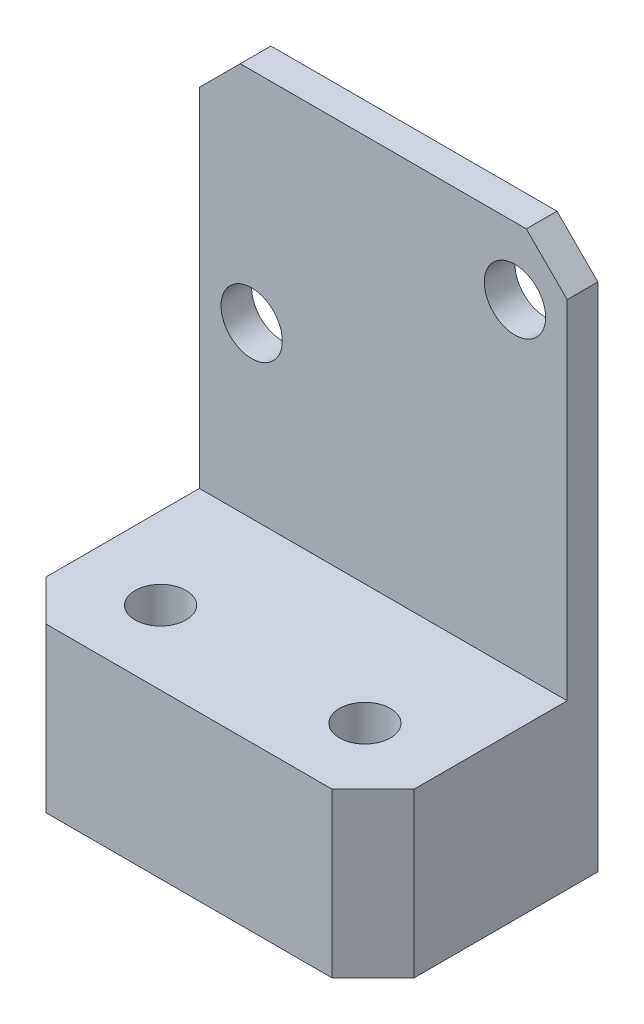
ISO-10303-21;
HEADER;
FILE_DESCRIPTION(('STEP AP214'),'2;1');
FILE_NAME('part.step','',(''),(''),'','','');
FILE_SCHEMA(('AUTOMOTIVE_DESIGN { 1 0 10303 214 1 1 1 1 }'));
ENDSEC;
DATA;
#1=APPLICATION_CONTEXT('core data for automotive mechanical design processes');
#2=APPLICATION_PROTOCOL_DEFINITION('international standard','automotive_design',2000,#1);
#3=PRODUCT_CONTEXT('',#1,'mechanical');
#4=PRODUCT('Part','Part','',(#3));
#5=PRODUCT_RELATED_PRODUCT_CATEGORY('part','',(#4));
#6=PRODUCT_DEFINITION_FORMATION('','',#4);
#7=PRODUCT_DEFINITION_CONTEXT('part definition',#1,'design');
#8=PRODUCT_DEFINITION('design','',#6,#7);
#9=PRODUCT_DEFINITION_SHAPE('','',#8);
#10=(LENGTH_UNIT() NAMED_UNIT(*) SI_UNIT(.MILLI.,.METRE.));
#11=(NAMED_UNIT(*) PLANE_ANGLE_UNIT() SI_UNIT($,.RADIAN.));
#12=(NAMED_UNIT(*) SI_UNIT($,.STERADIAN.) SOLID_ANGLE_UNIT());
#13=UNCERTAINTY_MEASURE_WITH_UNIT(LENGTH_MEASURE(1.E-05),#10,'distance_accuracy_value','');
#14=(GEOMETRIC_REPRESENTATION_CONTEXT(3) GLOBAL_UNCERTAINTY_ASSIGNED_CONTEXT((#13)) GLOBAL_UNIT_ASSIGNED_CONTEXT((#10,
#11,#12)) REPRESENTATION_CONTEXT('',''));
#15=CARTESIAN_POINT('',(0.,0.,0.));
#16=DIRECTION('',(0.,0.,1.));
#17=DIRECTION('',(1.,0.,0.));
#18=AXIS2_PLACEMENT_3D('',#15,#16,#17);
#19=CARTESIAN_POINT('',(-9.,7.,11.));
#20=DIRECTION('',(0.,-1.,0.));
#21=DIRECTION('',(0.,0.,-1.));
#22=AXIS2_PLACEMENT_3D('',#19,#20,#21);
#23=PLANE('',#22);
#24=DIRECTION('',(-1.,0.,0.));
#25=VECTOR('',#24,1.);
#26=CARTESIAN_POINT('',(-9.,7.,0.));
#27=LINE('',#26,#25);
#28=CARTESIAN_POINT('',(7.,7.,0.));
#29=VERTEX_POINT('',#28);
#30=CARTESIAN_POINT('',(-6.99999999999999,7.,0.));
#31=VERTEX_POINT('',#30);
#32=EDGE_CURVE('E150',#29,#31,#27,.T.);
#33=ORIENTED_EDGE('',*,*,#32,.T.);
#34=DIRECTION('',(0.,0.,1.));
#35=VECTOR('',#34,1.);
#36=CARTESIAN_POINT('',(-6.99999999999999,7.,11.));
#37=LINE('',#36,#35);
#38=CARTESIAN_POINT('',(-6.99999999999999,7.,1.5));
#39=VERTEX_POINT('',#38);
#40=EDGE_CURVE('E174',#31,#39,#37,.T.);
#41=ORIENTED_EDGE('',*,*,#40,.T.);
#42=DIRECTION('',(-1.,0.,0.));
#43=VECTOR('',#42,1.);
#44=CARTESIAN_POINT('',(-9.,7.,1.5));
#45=LINE('',#44,#43);
#46=CARTESIAN_POINT('',(7.00000000000001,7.,1.5));
#47=VERTEX_POINT('',#46);
#48=EDGE_CURVE('E140',#47,#39,#45,.T.);
#49=ORIENTED_EDGE('',*,*,#48,.F.);
#50=DIRECTION('',(0.,0.,-1.));
#51=VECTOR('',#50,1.);
#52=CARTESIAN_POINT('',(7.,7.,11.));
#53=LINE('',#52,#51);
#54=EDGE_CURVE('E171',#47,#29,#53,.T.);
#55=ORIENTED_EDGE('',*,*,#54,.T.);
#56=EDGE_LOOP('',(#33,#41,#49,#55));
#57=FACE_BOUND('',#56,.T.);
#58=ADVANCED_FACE('F34',(#57),#23,.F.);
#59=CARTESIAN_POINT('',(-9.,7.,11.));
#60=DIRECTION('',(1.,0.,0.));
#61=DIRECTION('',(0.,1.,0.));
#62=AXIS2_PLACEMENT_3D('',#59,#60,#61);
#63=PLANE('',#62);
#64=DIRECTION('',(0.,-1.,0.));
#65=VECTOR('',#64,1.);
#66=CARTESIAN_POINT('',(-9.,7.,1.5));
#67=LINE('',#66,#65);
#68=CARTESIAN_POINT('',(-9.,5.,1.5));
#69=VERTEX_POINT('',#68);
#70=CARTESIAN_POINT('',(-9.,-12.,1.5));
#71=VERTEX_POINT('',#70);
#72=EDGE_CURVE('E113',#69,#71,#67,.T.);
#73=ORIENTED_EDGE('',*,*,#72,.F.);
#74=DIRECTION('',(0.,0.,-1.));
#75=VECTOR('',#74,1.);
#76=CARTESIAN_POINT('',(-9.,5.,11.));
#77=LINE('',#76,#75);
#78=CARTESIAN_POINT('',(-9.,5.,0.));
#79=VERTEX_POINT('',#78);
#80=EDGE_CURVE('E165',#69,#79,#77,.T.);
#81=ORIENTED_EDGE('',*,*,#80,.T.);
#82=DIRECTION('',(0.,-1.,0.));
#83=VECTOR('',#82,1.);
#84=CARTESIAN_POINT('',(-9.,7.,0.));
#85=LINE('',#84,#83);
#86=CARTESIAN_POINT('',(-9.,-20.,0.));
#87=VERTEX_POINT('',#86);
#88=EDGE_CURVE('E142',#79,#87,#85,.T.);
#89=ORIENTED_EDGE('',*,*,#88,.T.);
#90=DIRECTION('',(0.,0.,-1.));
#91=VECTOR('',#90,1.);
#92=CARTESIAN_POINT('',(-9.,-20.,11.));
#93=LINE('',#92,#91);
#94=CARTESIAN_POINT('',(-9.,-20.,8.99999999999999));
#95=VERTEX_POINT('',#94);
#96=EDGE_CURVE('E162',#95,#87,#93,.T.);
#97=ORIENTED_EDGE('',*,*,#96,.F.);
#98=DIRECTION('',(0.,1.,0.));
#99=VECTOR('',#98,1.);
#100=CARTESIAN_POINT('',(-9.,-12.,8.99999999999999));
#101=LINE('',#100,#99);
#102=CARTESIAN_POINT('',(-9.,-12.,8.99999999999999));
#103=VERTEX_POINT('',#102);
#104=EDGE_CURVE('E139',#95,#103,#101,.T.);
#105=ORIENTED_EDGE('',*,*,#104,.T.);
#106=DIRECTION('',(0.,0.,1.));
#107=VECTOR('',#106,1.);
#108=CARTESIAN_POINT('',(-9.,-12.,1.5));
#109=LINE('',#108,#107);
#110=EDGE_CURVE('E131',#71,#103,#109,.T.);
#111=ORIENTED_EDGE('',*,*,#110,.F.);
#112=EDGE_LOOP('',(#73,#81,#89,#97,#105,#111));
#113=FACE_BOUND('',#112,.T.);
#114=ADVANCED_FACE('F137',(#113),#63,.F.);
#115=CARTESIAN_POINT('',(-9.,-20.,11.));
#116=DIRECTION('',(0.,1.,0.));
#117=DIRECTION('',(0.,0.,1.));
#118=AXIS2_PLACEMENT_3D('',#115,#116,#117);
#119=PLANE('',#118);
#120=CARTESIAN_POINT('',(5.00000000000001,-20.,7.4));
#121=DIRECTION('',(0.,1.,0.));
#122=DIRECTION('',(0.,0.,1.));
#123=AXIS2_PLACEMENT_3D('',#120,#121,#122);
#124=CIRCLE('',#123,1.25);
#125=CARTESIAN_POINT('',(5.00000000000001,-20.,8.65));
#126=VERTEX_POINT('',#125);
#127=EDGE_CURVE('E266',#126,#126,#124,.F.);
#128=ORIENTED_EDGE('',*,*,#127,.F.);
#129=EDGE_LOOP('',(#128));
#130=FACE_BOUND('',#129,.T.);
#131=CARTESIAN_POINT('',(-4.99999999999999,-20.,7.4));
#132=DIRECTION('',(0.,1.,0.));
#133=DIRECTION('',(0.,0.,1.));
#134=AXIS2_PLACEMENT_3D('',#131,#132,#133);
#135=CIRCLE('',#134,1.25);
#136=CARTESIAN_POINT('',(-4.99999999999999,-20.,8.65));
#137=VERTEX_POINT('',#136);
#138=EDGE_CURVE('E260',#137,#137,#135,.F.);
#139=ORIENTED_EDGE('',*,*,#138,.F.);
#140=EDGE_LOOP('',(#139));
#141=FACE_BOUND('',#140,.T.);
#142=DIRECTION('',(1.,0.,0.));
#143=VECTOR('',#142,1.);
#144=CARTESIAN_POINT('',(-9.,-20.,11.));
#145=LINE('',#144,#143);
#146=CARTESIAN_POINT('',(-7.,-20.,11.));
#147=VERTEX_POINT('',#146);
#148=CARTESIAN_POINT('',(7.,-20.,11.));
#149=VERTEX_POINT('',#148);
#150=EDGE_CURVE('E147',#147,#149,#145,.T.);
#151=ORIENTED_EDGE('',*,*,#150,.F.);
#152=DIRECTION('',(-0.707106781186546,0.,-0.707106781186549));
#153=VECTOR('',#152,1.);
#154=CARTESIAN_POINT('',(-7.,-20.,11.));
#155=LINE('',#154,#153);
#156=EDGE_CURVE('E57',#147,#95,#155,.T.);
#157=ORIENTED_EDGE('',*,*,#156,.T.);
#158=ORIENTED_EDGE('',*,*,#96,.T.);
#159=DIRECTION('',(1.,0.,0.));
#160=VECTOR('',#159,1.);
#161=CARTESIAN_POINT('',(-9.,-20.,0.));
#162=LINE('',#161,#160);
#163=CARTESIAN_POINT('',(9.00000000000001,-20.,0.));
#164=VERTEX_POINT('',#163);
#165=EDGE_CURVE('E153',#87,#164,#162,.T.);
#166=ORIENTED_EDGE('',*,*,#165,.T.);
#167=DIRECTION('',(0.,0.,-1.));
#168=VECTOR('',#167,1.);
#169=CARTESIAN_POINT('',(9.00000000000001,-20.,11.));
#170=LINE('',#169,#168);
#171=CARTESIAN_POINT('',(9.00000000000001,-20.,8.99999999999999));
#172=VERTEX_POINT('',#171);
#173=EDGE_CURVE('E149',#172,#164,#170,.T.);
#174=ORIENTED_EDGE('',*,*,#173,.F.);
#175=DIRECTION('',(-0.707106781186547,0.,0.707106781186548));
#176=VECTOR('',#175,1.);
#177=CARTESIAN_POINT('',(7.,-20.,11.));
#178=LINE('',#177,#176);
#179=EDGE_CURVE('E49',#172,#149,#178,.T.);
#180=ORIENTED_EDGE('',*,*,#179,.T.);
#181=EDGE_LOOP('',(#151,#157,#158,#166,#174,#180));
#182=FACE_BOUND('',#181,.T.);
#183=ADVANCED_FACE('F198',(#130,#141,#182),#119,.F.);
#184=CARTESIAN_POINT('',(9.,7.,11.));
#185=DIRECTION('',(-1.,0.,0.));
#186=DIRECTION('',(0.,-1.,0.));
#187=AXIS2_PLACEMENT_3D('',#184,#185,#186);
#188=PLANE('',#187);
#189=DIRECTION('',(0.,1.,0.));
#190=VECTOR('',#189,1.);
#191=CARTESIAN_POINT('',(9.,7.,0.));
#192=LINE('',#191,#190);
#193=CARTESIAN_POINT('',(9.,4.99999999999999,0.));
#194=VERTEX_POINT('',#193);
#195=EDGE_CURVE('E156',#164,#194,#192,.T.);
#196=ORIENTED_EDGE('',*,*,#195,.T.);
#197=DIRECTION('',(0.,0.,1.));
#198=VECTOR('',#197,1.);
#199=CARTESIAN_POINT('',(9.,4.99999999999999,11.));
#200=LINE('',#199,#198);
#201=CARTESIAN_POINT('',(9.00000000000001,4.99999999999999,1.5));
#202=VERTEX_POINT('',#201);
#203=EDGE_CURVE('E181',#194,#202,#200,.T.);
#204=ORIENTED_EDGE('',*,*,#203,.T.);
#205=DIRECTION('',(0.,1.,0.));
#206=VECTOR('',#205,1.);
#207=CARTESIAN_POINT('',(9.00000000000001,7.,1.5));
#208=LINE('',#207,#206);
#209=CARTESIAN_POINT('',(9.00000000000001,-12.,1.5));
#210=VERTEX_POINT('',#209);
#211=EDGE_CURVE('E135',#210,#202,#208,.T.);
#212=ORIENTED_EDGE('',*,*,#211,.F.);
#213=DIRECTION('',(0.,0.,1.));
#214=VECTOR('',#213,1.);
#215=CARTESIAN_POINT('',(9.00000000000001,-12.,1.5));
#216=LINE('',#215,#214);
#217=CARTESIAN_POINT('',(9.00000000000001,-12.,8.99999999999999));
#218=VERTEX_POINT('',#217);
#219=EDGE_CURVE('E134',#210,#218,#216,.T.);
#220=ORIENTED_EDGE('',*,*,#219,.T.);
#221=DIRECTION('',(0.,-1.,0.));
#222=VECTOR('',#221,1.);
#223=CARTESIAN_POINT('',(9.00000000000001,-20.,8.99999999999999));
#224=LINE('',#223,#222);
#225=EDGE_CURVE('E179',#218,#172,#224,.T.);
#226=ORIENTED_EDGE('',*,*,#225,.T.);
#227=ORIENTED_EDGE('',*,*,#173,.T.);
#228=EDGE_LOOP('',(#196,#204,#212,#220,#226,#227));
#229=FACE_BOUND('',#228,.T.);
#230=ADVANCED_FACE('F195',(#229),#188,.F.);
#231=CARTESIAN_POINT('',(-9.,-20.,11.));
#232=DIRECTION('',(0.,0.,1.));
#233=DIRECTION('',(1.,0.,0.));
#234=AXIS2_PLACEMENT_3D('',#231,#232,#233);
#235=PLANE('',#234);
#236=DIRECTION('',(1.,0.,0.));
#237=VECTOR('',#236,1.);
#238=CARTESIAN_POINT('',(-9.,-12.,11.));
#239=LINE('',#238,#237);
#240=CARTESIAN_POINT('',(-7.,-12.,11.));
#241=VERTEX_POINT('',#240);
#242=CARTESIAN_POINT('',(7.,-12.,11.));
#243=VERTEX_POINT('',#242);
#244=EDGE_CURVE('E126',#241,#243,#239,.T.);
#245=ORIENTED_EDGE('',*,*,#244,.F.);
#246=DIRECTION('',(0.,-1.,0.));
#247=VECTOR('',#246,1.);
#248=CARTESIAN_POINT('',(-7.,-20.,11.));
#249=LINE('',#248,#247);
#250=EDGE_CURVE('E186',#241,#147,#249,.T.);
#251=ORIENTED_EDGE('',*,*,#250,.T.);
#252=ORIENTED_EDGE('',*,*,#150,.T.);
#253=DIRECTION('',(0.,1.,0.));
#254=VECTOR('',#253,1.);
#255=CARTESIAN_POINT('',(7.,-12.,11.));
#256=LINE('',#255,#254);
#257=EDGE_CURVE('E183',#149,#243,#256,.T.);
#258=ORIENTED_EDGE('',*,*,#257,.T.);
#259=EDGE_LOOP('',(#245,#251,#252,#258));
#260=FACE_BOUND('',#259,.T.);
#261=ADVANCED_FACE('F197',(#260),#235,.T.);
#262=CARTESIAN_POINT('',(-9.,-20.,0.));
#263=DIRECTION('',(0.,0.,1.));
#264=DIRECTION('',(1.,0.,0.));
#265=AXIS2_PLACEMENT_3D('',#262,#263,#264);
#266=PLANE('',#265);
#267=CARTESIAN_POINT('',(-6.44322900415622,-3.72,0.));
#268=DIRECTION('',(0.,0.,1.));
#269=DIRECTION('',(1.,0.,0.));
#270=AXIS2_PLACEMENT_3D('',#267,#268,#269);
#271=CIRCLE('',#270,1.5);
#272=CARTESIAN_POINT('',(-4.94322900415622,-3.72,0.));
#273=VERTEX_POINT('',#272);
#274=EDGE_CURVE('E252',#273,#273,#271,.F.);
#275=ORIENTED_EDGE('',*,*,#274,.F.);
#276=EDGE_LOOP('',(#275));
#277=FACE_BOUND('',#276,.T.);
#278=CARTESIAN_POINT('',(6.44322900415622,3.72,0.));
#279=DIRECTION('',(0.,0.,1.));
#280=DIRECTION('',(1.,0.,0.));
#281=AXIS2_PLACEMENT_3D('',#278,#279,#280);
#282=CIRCLE('',#281,1.5);
#283=CARTESIAN_POINT('',(7.94322900415622,3.72,0.));
#284=VERTEX_POINT('',#283);
#285=EDGE_CURVE('E245',#284,#284,#282,.F.);
#286=ORIENTED_EDGE('',*,*,#285,.F.);
#287=EDGE_LOOP('',(#286));
#288=FACE_BOUND('',#287,.T.);
#289=ORIENTED_EDGE('',*,*,#88,.F.);
#290=DIRECTION('',(-0.707106781186549,-0.707106781186546,0.));
#291=VECTOR('',#290,1.);
#292=CARTESIAN_POINT('',(-9.,5.,0.));
#293=LINE('',#292,#291);
#294=EDGE_CURVE('E169',#79,#31,#293,.F.);
#295=ORIENTED_EDGE('',*,*,#294,.T.);
#296=ORIENTED_EDGE('',*,*,#32,.F.);
#297=DIRECTION('',(-0.707106781186546,0.707106781186549,0.));
#298=VECTOR('',#297,1.);
#299=CARTESIAN_POINT('',(7.,7.,0.));
#300=LINE('',#299,#298);
#301=EDGE_CURVE('E167',#29,#194,#300,.F.);
#302=ORIENTED_EDGE('',*,*,#301,.T.);
#303=ORIENTED_EDGE('',*,*,#195,.F.);
#304=ORIENTED_EDGE('',*,*,#165,.F.);
#305=EDGE_LOOP('',(#289,#295,#296,#302,#303,#304));
#306=FACE_BOUND('',#305,.T.);
#307=ADVANCED_FACE('F220',(#277,#288,#306),#266,.F.);
#308=CARTESIAN_POINT('',(-9.,-12.,1.5));
#309=DIRECTION('',(0.,-1.,0.));
#310=DIRECTION('',(0.,0.,-1.));
#311=AXIS2_PLACEMENT_3D('',#308,#309,#310);
#312=PLANE('',#311);
#313=CARTESIAN_POINT('',(5.,-12.,7.4));
#314=DIRECTION('',(0.,1.,0.));
#315=DIRECTION('',(-1.,0.,0.));
#316=AXIS2_PLACEMENT_3D('',#313,#314,#315);
#317=CIRCLE('',#316,1.25);
#318=CARTESIAN_POINT('',(3.75,-12.,7.4));
#319=VERTEX_POINT('',#318);
#320=EDGE_CURVE('E269',#319,#319,#317,.T.);
#321=ORIENTED_EDGE('',*,*,#320,.F.);
#322=EDGE_LOOP('',(#321));
#323=FACE_BOUND('',#322,.T.);
#324=CARTESIAN_POINT('',(-5.,-12.,7.4));
#325=DIRECTION('',(0.,1.,0.));
#326=DIRECTION('',(-1.,0.,0.));
#327=AXIS2_PLACEMENT_3D('',#324,#325,#326);
#328=CIRCLE('',#327,1.25);
#329=CARTESIAN_POINT('',(-6.25,-12.,7.4));
#330=VERTEX_POINT('',#329);
#331=EDGE_CURVE('E263',#330,#330,#328,.T.);
#332=ORIENTED_EDGE('',*,*,#331,.F.);
#333=EDGE_LOOP('',(#332));
#334=FACE_BOUND('',#333,.T.);
#335=ORIENTED_EDGE('',*,*,#110,.T.);
#336=DIRECTION('',(0.707106781186546,0.,0.707106781186549));
#337=VECTOR('',#336,1.);
#338=CARTESIAN_POINT('',(-7.,-12.,11.));
#339=LINE('',#338,#337);
#340=EDGE_CURVE('E11',#103,#241,#339,.T.);
#341=ORIENTED_EDGE('',*,*,#340,.T.);
#342=ORIENTED_EDGE('',*,*,#244,.T.);
#343=DIRECTION('',(0.707106781186547,0.,-0.707106781186548));
#344=VECTOR('',#343,1.);
#345=CARTESIAN_POINT('',(7.,-12.,11.));
#346=LINE('',#345,#344);
#347=EDGE_CURVE('E42',#243,#218,#346,.T.);
#348=ORIENTED_EDGE('',*,*,#347,.T.);
#349=ORIENTED_EDGE('',*,*,#219,.F.);
#350=DIRECTION('',(1.,0.,0.));
#351=VECTOR('',#350,1.);
#352=CARTESIAN_POINT('',(-9.,-12.,1.5));
#353=LINE('',#352,#351);
#354=EDGE_CURVE('E118',#71,#210,#353,.T.);
#355=ORIENTED_EDGE('',*,*,#354,.F.);
#356=EDGE_LOOP('',(#335,#341,#342,#348,#349,#355));
#357=FACE_BOUND('',#356,.T.);
#358=ADVANCED_FACE('F130',(#323,#334,#357),#312,.F.);
#359=CARTESIAN_POINT('',(-9.,-12.,1.5));
#360=DIRECTION('',(0.,0.,1.));
#361=DIRECTION('',(1.,0.,0.));
#362=AXIS2_PLACEMENT_3D('',#359,#360,#361);
#363=PLANE('',#362);
#364=CARTESIAN_POINT('',(-6.44322900415622,-3.72,1.5));
#365=DIRECTION('',(0.,0.,1.));
#366=DIRECTION('',(1.,0.,0.));
#367=AXIS2_PLACEMENT_3D('',#364,#365,#366);
#368=CIRCLE('',#367,1.5);
#369=CARTESIAN_POINT('',(-4.94322900415622,-3.72,1.5));
#370=VERTEX_POINT('',#369);
#371=EDGE_CURVE('E257',#370,#370,#368,.T.);
#372=ORIENTED_EDGE('',*,*,#371,.F.);
#373=EDGE_LOOP('',(#372));
#374=FACE_BOUND('',#373,.T.);
#375=CARTESIAN_POINT('',(6.44322900415622,3.72,1.5));
#376=DIRECTION('',(0.,0.,1.));
#377=DIRECTION('',(1.,0.,0.));
#378=AXIS2_PLACEMENT_3D('',#375,#376,#377);
#379=CIRCLE('',#378,1.5);
#380=CARTESIAN_POINT('',(7.94322900415622,3.72,1.5));
#381=VERTEX_POINT('',#380);
#382=EDGE_CURVE('E247',#381,#381,#379,.T.);
#383=ORIENTED_EDGE('',*,*,#382,.F.);
#384=EDGE_LOOP('',(#383));
#385=FACE_BOUND('',#384,.T.);
#386=ORIENTED_EDGE('',*,*,#48,.T.);
#387=DIRECTION('',(0.707106781186549,0.707106781186546,0.));
#388=VECTOR('',#387,1.);
#389=CARTESIAN_POINT('',(-17.5,-3.49999999999997,1.5));
#390=LINE('',#389,#388);
#391=EDGE_CURVE('E121',#39,#69,#390,.F.);
#392=ORIENTED_EDGE('',*,*,#391,.T.);
#393=ORIENTED_EDGE('',*,*,#72,.T.);
#394=ORIENTED_EDGE('',*,*,#354,.T.);
#395=ORIENTED_EDGE('',*,*,#211,.T.);
#396=DIRECTION('',(0.707106781186546,-0.707106781186549,0.));
#397=VECTOR('',#396,1.);
#398=CARTESIAN_POINT('',(8.50000000000004,5.49999999999996,1.5));
#399=LINE('',#398,#397);
#400=EDGE_CURVE('E176',#202,#47,#399,.F.);
#401=ORIENTED_EDGE('',*,*,#400,.T.);
#402=EDGE_LOOP('',(#386,#392,#393,#394,#395,#401));
#403=FACE_BOUND('',#402,.T.);
#404=ADVANCED_FACE('F116',(#374,#385,#403),#363,.T.);
#405=CARTESIAN_POINT('',(6.44322900415622,3.72,-4.24264068711929));
#406=DIRECTION('',(0.,0.,1.));
#407=DIRECTION('',(1.,0.,0.));
#408=AXIS2_PLACEMENT_3D('',#405,#406,#407);
#409=CYLINDRICAL_SURFACE('',#408,1.5);
#410=ORIENTED_EDGE('',*,*,#285,.T.);
#411=EDGE_LOOP('',(#410));
#412=FACE_BOUND('',#411,.T.);
#413=ORIENTED_EDGE('',*,*,#382,.T.);
#414=EDGE_LOOP('',(#413));
#415=FACE_BOUND('',#414,.T.);
#416=ADVANCED_FACE('F286',(#412,#415),#409,.F.);
#417=CARTESIAN_POINT('',(-6.44322900415622,-3.72,-4.24264068711929));
#418=DIRECTION('',(0.,0.,1.));
#419=DIRECTION('',(1.,0.,0.));
#420=AXIS2_PLACEMENT_3D('',#417,#418,#419);
#421=CYLINDRICAL_SURFACE('',#420,1.5);
#422=ORIENTED_EDGE('',*,*,#274,.T.);
#423=EDGE_LOOP('',(#422));
#424=FACE_BOUND('',#423,.T.);
#425=ORIENTED_EDGE('',*,*,#371,.T.);
#426=EDGE_LOOP('',(#425));
#427=FACE_BOUND('',#426,.T.);
#428=ADVANCED_FACE('F280',(#424,#427),#421,.F.);
#429=CARTESIAN_POINT('',(-4.99999999999999,-23.5355339059327,7.4));
#430=DIRECTION('',(0.,1.,0.));
#431=DIRECTION('',(-1.,0.,0.));
#432=AXIS2_PLACEMENT_3D('',#429,#430,#431);
#433=CYLINDRICAL_SURFACE('',#432,1.25);
#434=ORIENTED_EDGE('',*,*,#138,.T.);
#435=EDGE_LOOP('',(#434));
#436=FACE_BOUND('',#435,.T.);
#437=ORIENTED_EDGE('',*,*,#331,.T.);
#438=EDGE_LOOP('',(#437));
#439=FACE_BOUND('',#438,.T.);
#440=ADVANCED_FACE('F233',(#436,#439),#433,.F.);
#441=CARTESIAN_POINT('',(5.00000000000001,-23.5355339059327,7.4));
#442=DIRECTION('',(0.,1.,0.));
#443=DIRECTION('',(-1.,0.,0.));
#444=AXIS2_PLACEMENT_3D('',#441,#442,#443);
#445=CYLINDRICAL_SURFACE('',#444,1.25);
#446=ORIENTED_EDGE('',*,*,#127,.T.);
#447=EDGE_LOOP('',(#446));
#448=FACE_BOUND('',#447,.T.);
#449=ORIENTED_EDGE('',*,*,#320,.T.);
#450=EDGE_LOOP('',(#449));
#451=FACE_BOUND('',#450,.T.);
#452=ADVANCED_FACE('F228',(#448,#451),#445,.F.);
#453=CARTESIAN_POINT('',(-9.,5.,11.));
#454=DIRECTION('',(0.707106781186546,-0.707106781186549,0.));
#455=DIRECTION('',(0.707106781186549,0.707106781186546,0.));
#456=AXIS2_PLACEMENT_3D('',#453,#454,#455);
#457=PLANE('',#456);
#458=ORIENTED_EDGE('',*,*,#391,.F.);
#459=ORIENTED_EDGE('',*,*,#40,.F.);
#460=ORIENTED_EDGE('',*,*,#294,.F.);
#461=ORIENTED_EDGE('',*,*,#80,.F.);
#462=EDGE_LOOP('',(#458,#459,#460,#461));
#463=FACE_BOUND('',#462,.T.);
#464=ADVANCED_FACE('F208',(#463),#457,.F.);
#465=CARTESIAN_POINT('',(7.,7.,11.));
#466=DIRECTION('',(-0.707106781186549,-0.707106781186546,0.));
#467=DIRECTION('',(0.707106781186546,-0.707106781186549,0.));
#468=AXIS2_PLACEMENT_3D('',#465,#466,#467);
#469=PLANE('',#468);
#470=ORIENTED_EDGE('',*,*,#400,.F.);
#471=ORIENTED_EDGE('',*,*,#203,.F.);
#472=ORIENTED_EDGE('',*,*,#301,.F.);
#473=ORIENTED_EDGE('',*,*,#54,.F.);
#474=EDGE_LOOP('',(#470,#471,#472,#473));
#475=FACE_BOUND('',#474,.T.);
#476=ADVANCED_FACE('F203',(#475),#469,.F.);
#477=CARTESIAN_POINT('',(-7.,-20.,11.));
#478=DIRECTION('',(-0.707106781186549,0.,0.707106781186546));
#479=DIRECTION('',(0.707106781186546,0.,0.707106781186549));
#480=AXIS2_PLACEMENT_3D('',#477,#478,#479);
#481=PLANE('',#480);
#482=ORIENTED_EDGE('',*,*,#340,.F.);
#483=ORIENTED_EDGE('',*,*,#104,.F.);
#484=ORIENTED_EDGE('',*,*,#156,.F.);
#485=ORIENTED_EDGE('',*,*,#250,.F.);
#486=EDGE_LOOP('',(#482,#483,#484,#485));
#487=FACE_BOUND('',#486,.T.);
#488=ADVANCED_FACE('F201',(#487),#481,.T.);
#489=CARTESIAN_POINT('',(7.,-20.,11.));
#490=DIRECTION('',(0.707106781186548,0.,0.707106781186547));
#491=DIRECTION('',(0.707106781186547,0.,-0.707106781186548));
#492=AXIS2_PLACEMENT_3D('',#489,#490,#491);
#493=PLANE('',#492);
#494=ORIENTED_EDGE('',*,*,#179,.F.);
#495=ORIENTED_EDGE('',*,*,#225,.F.);
#496=ORIENTED_EDGE('',*,*,#347,.F.);
#497=ORIENTED_EDGE('',*,*,#257,.F.);
#498=EDGE_LOOP('',(#494,#495,#496,#497));
#499=FACE_BOUND('',#498,.T.);
#500=ADVANCED_FACE('F36',(#499),#493,.T.);
#501=CLOSED_SHELL('',(#58,#114,#183,#230,#261,#307,#358,#404,#416,#428,#440,#452,#464,#476,#488,#500));
#502=MANIFOLD_SOLID_BREP('B2',#501);
#503=ADVANCED_BREP_SHAPE_REPRESENTATION('',(#18,#502),#14);
#504=SHAPE_DEFINITION_REPRESENTATION(#9,#503);
ENDSEC;
END-ISO-10303-21;
